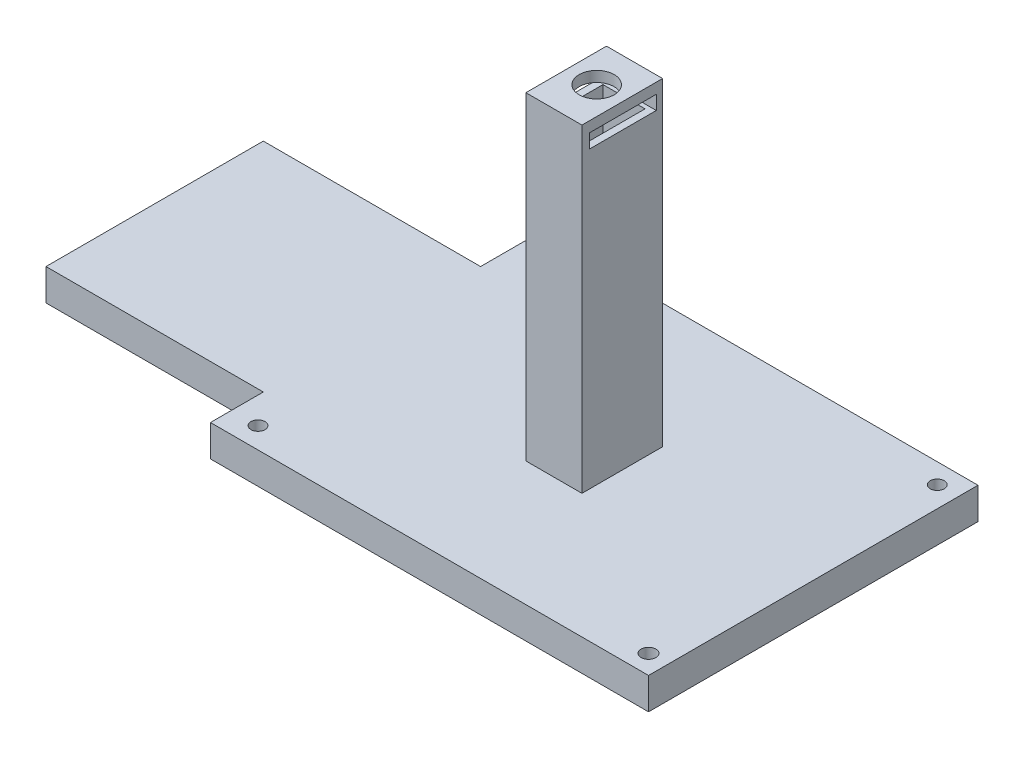
ISO-10303-21;
HEADER;
FILE_DESCRIPTION(('STEP AP214'),'2;1');
FILE_NAME('part.step','',(''),(''),'','','');
FILE_SCHEMA(('AUTOMOTIVE_DESIGN { 1 0 10303 214 1 1 1 1 }'));
ENDSEC;
DATA;
#1=APPLICATION_CONTEXT('core data for automotive mechanical design processes');
#2=APPLICATION_PROTOCOL_DEFINITION('international standard','automotive_design',2000,#1);
#3=PRODUCT_CONTEXT('',#1,'mechanical');
#4=PRODUCT('Part','Part','',(#3));
#5=PRODUCT_RELATED_PRODUCT_CATEGORY('part','',(#4));
#6=PRODUCT_DEFINITION_FORMATION('','',#4);
#7=PRODUCT_DEFINITION_CONTEXT('part definition',#1,'design');
#8=PRODUCT_DEFINITION('design','',#6,#7);
#9=PRODUCT_DEFINITION_SHAPE('','',#8);
#10=(LENGTH_UNIT() NAMED_UNIT(*) SI_UNIT(.MILLI.,.METRE.));
#11=(NAMED_UNIT(*) PLANE_ANGLE_UNIT() SI_UNIT($,.RADIAN.));
#12=(NAMED_UNIT(*) SI_UNIT($,.STERADIAN.) SOLID_ANGLE_UNIT());
#13=UNCERTAINTY_MEASURE_WITH_UNIT(LENGTH_MEASURE(1.E-05),#10,'distance_accuracy_value','');
#14=(GEOMETRIC_REPRESENTATION_CONTEXT(3) GLOBAL_UNCERTAINTY_ASSIGNED_CONTEXT((#13)) GLOBAL_UNIT_ASSIGNED_CONTEXT((#10,
#11,#12)) REPRESENTATION_CONTEXT('',''));
#15=CARTESIAN_POINT('',(0.,0.,0.));
#16=DIRECTION('',(0.,0.,1.));
#17=DIRECTION('',(1.,0.,0.));
#18=AXIS2_PLACEMENT_3D('',#15,#16,#17);
#19=CARTESIAN_POINT('',(-61.7229129662522,9.,-30.9724689165187));
#20=DIRECTION('',(1.,0.,0.));
#21=DIRECTION('',(0.,0.,-1.));
#22=AXIS2_PLACEMENT_3D('',#19,#20,#21);
#23=PLANE('',#22);
#24=DIRECTION('',(0.,-1.,0.));
#25=VECTOR('',#24,1.);
#26=CARTESIAN_POINT('',(-61.7229129662522,9.,-14.0524740715815));
#27=LINE('',#26,#25);
#28=CARTESIAN_POINT('',(-61.7229129662522,9.,-14.0524740715815));
#29=VERTEX_POINT('',#28);
#30=CARTESIAN_POINT('',(-61.7229129662522,0.,-14.0524740715815));
#31=VERTEX_POINT('',#30);
#32=EDGE_CURVE('E190',#29,#31,#27,.T.);
#33=ORIENTED_EDGE('',*,*,#32,.F.);
#34=DIRECTION('',(0.,0.,1.));
#35=VECTOR('',#34,1.);
#36=CARTESIAN_POINT('',(-61.7229129662522,9.,-30.9724689165187));
#37=LINE('',#36,#35);
#38=CARTESIAN_POINT('',(-61.7229129662522,9.,-30.9724689165187));
#39=VERTEX_POINT('',#38);
#40=EDGE_CURVE('E202',#39,#29,#37,.T.);
#41=ORIENTED_EDGE('',*,*,#40,.F.);
#42=DIRECTION('',(0.,-1.,0.));
#43=VECTOR('',#42,1.);
#44=CARTESIAN_POINT('',(-61.7229129662522,9.,-30.9724689165187));
#45=LINE('',#44,#43);
#46=CARTESIAN_POINT('',(-61.7229129662522,0.,-30.9724689165187));
#47=VERTEX_POINT('',#46);
#48=EDGE_CURVE('E224',#39,#47,#45,.T.);
#49=ORIENTED_EDGE('',*,*,#48,.T.);
#50=DIRECTION('',(0.,0.,1.));
#51=VECTOR('',#50,1.);
#52=CARTESIAN_POINT('',(-61.7229129662522,0.,-30.9724689165187));
#53=LINE('',#52,#51);
#54=EDGE_CURVE('E204',#47,#31,#53,.T.);
#55=ORIENTED_EDGE('',*,*,#54,.T.);
#56=EDGE_LOOP('',(#33,#41,#49,#55));
#57=FACE_BOUND('',#56,.T.);
#58=ADVANCED_FACE('F47',(#57),#23,.F.);
#59=CARTESIAN_POINT('',(0.,0.,0.));
#60=DIRECTION('',(0.,1.,0.));
#61=DIRECTION('',(0.,0.,1.));
#62=AXIS2_PLACEMENT_3D('',#59,#60,#61);
#63=PLANE('',#62);
#64=CARTESIAN_POINT('',(-54.169424944203,0.,57.0075310834813));
#65=DIRECTION('',(0.,1.,0.));
#66=DIRECTION('',(0.,0.,1.));
#67=AXIS2_PLACEMENT_3D('',#64,#65,#66);
#68=CIRCLE('',#67,2.00035170443916);
#69=CARTESIAN_POINT('',(-54.169424944203,0.,59.0078827879205));
#70=VERTEX_POINT('',#69);
#71=EDGE_CURVE('E205',#70,#70,#68,.T.);
#72=ORIENTED_EDGE('',*,*,#71,.T.);
#73=EDGE_LOOP('',(#72));
#74=FACE_BOUND('',#73,.T.);
#75=CARTESIAN_POINT('',(57.809152833806,0.,57.5719057944541));
#76=DIRECTION('',(0.,1.,0.));
#77=DIRECTION('',(0.,0.,1.));
#78=AXIS2_PLACEMENT_3D('',#75,#76,#77);
#79=CIRCLE('',#78,2.10858653380464);
#80=CARTESIAN_POINT('',(57.809152833806,0.,59.6804923282588));
#81=VERTEX_POINT('',#80);
#82=EDGE_CURVE('E382',#81,#81,#79,.T.);
#83=ORIENTED_EDGE('',*,*,#82,.T.);
#84=EDGE_LOOP('',(#83));
#85=FACE_BOUND('',#84,.T.);
#86=CARTESIAN_POINT('',(57.3356631587285,0.,-25.2880942055459));
#87=DIRECTION('',(0.,1.,0.));
#88=DIRECTION('',(0.,0.,1.));
#89=AXIS2_PLACEMENT_3D('',#86,#87,#88);
#90=CIRCLE('',#89,2.00297321360997);
#91=CARTESIAN_POINT('',(57.3356631587285,0.,-23.2851209919359));
#92=VERTEX_POINT('',#91);
#93=EDGE_CURVE('E379',#92,#92,#90,.T.);
#94=ORIENTED_EDGE('',*,*,#93,.T.);
#95=EDGE_LOOP('',(#94));
#96=FACE_BOUND('',#95,.T.);
#97=CARTESIAN_POINT('',(-54.5129129662522,0.,-25.8524689165187));
#98=DIRECTION('',(0.,1.,0.));
#99=DIRECTION('',(0.,0.,1.));
#100=AXIS2_PLACEMENT_3D('',#97,#98,#99);
#101=CIRCLE('',#100,2.);
#102=CARTESIAN_POINT('',(-54.5129129662522,0.,-23.8524689165187));
#103=VERTEX_POINT('',#102);
#104=EDGE_CURVE('E250',#103,#103,#101,.T.);
#105=ORIENTED_EDGE('',*,*,#104,.T.);
#106=EDGE_LOOP('',(#105));
#107=FACE_BOUND('',#106,.T.);
#108=ORIENTED_EDGE('',*,*,#54,.F.);
#109=DIRECTION('',(-1.,0.,0.));
#110=VECTOR('',#109,1.);
#111=CARTESIAN_POINT('',(-61.7229129662522,0.,-30.9724689165187));
#112=LINE('',#111,#110);
#113=CARTESIAN_POINT('',(63.2770870337478,0.,-30.9724689165187));
#114=VERTEX_POINT('',#113);
#115=EDGE_CURVE('E217',#114,#47,#112,.T.);
#116=ORIENTED_EDGE('',*,*,#115,.F.);
#117=DIRECTION('',(0.,0.,-1.));
#118=VECTOR('',#117,1.);
#119=CARTESIAN_POINT('',(63.2770870337478,0.,-30.9724689165187));
#120=LINE('',#119,#118);
#121=CARTESIAN_POINT('',(63.2770870337478,0.,63.0275310834813));
#122=VERTEX_POINT('',#121);
#123=EDGE_CURVE('E229',#122,#114,#120,.T.);
#124=ORIENTED_EDGE('',*,*,#123,.F.);
#125=DIRECTION('',(1.,0.,0.));
#126=VECTOR('',#125,1.);
#127=CARTESIAN_POINT('',(-61.7229129662522,0.,63.0275310834813));
#128=LINE('',#127,#126);
#129=CARTESIAN_POINT('',(-61.7229129662522,0.,63.0275310834813));
#130=VERTEX_POINT('',#129);
#131=EDGE_CURVE('E226',#130,#122,#128,.T.);
#132=ORIENTED_EDGE('',*,*,#131,.F.);
#133=CARTESIAN_POINT('',(-61.7229129662522,0.,47.9475259284185));
#134=VERTEX_POINT('',#133);
#135=EDGE_CURVE('E227',#134,#130,#53,.T.);
#136=ORIENTED_EDGE('',*,*,#135,.F.);
#137=DIRECTION('',(1.,0.,0.));
#138=VECTOR('',#137,1.);
#139=CARTESIAN_POINT('',(-61.7229129662522,0.,47.9475259284185));
#140=LINE('',#139,#138);
#141=CARTESIAN_POINT('',(-123.722912966252,0.,47.9475259284185));
#142=VERTEX_POINT('',#141);
#143=EDGE_CURVE('E64',#142,#134,#140,.T.);
#144=ORIENTED_EDGE('',*,*,#143,.F.);
#145=DIRECTION('',(0.,0.,1.));
#146=VECTOR('',#145,1.);
#147=CARTESIAN_POINT('',(-123.722912966252,0.,47.9475259284185));
#148=LINE('',#147,#146);
#149=CARTESIAN_POINT('',(-123.722912966252,0.,-14.0524740715815));
#150=VERTEX_POINT('',#149);
#151=EDGE_CURVE('E434',#150,#142,#148,.T.);
#152=ORIENTED_EDGE('',*,*,#151,.F.);
#153=DIRECTION('',(-1.,0.,0.));
#154=VECTOR('',#153,1.);
#155=CARTESIAN_POINT('',(-61.7229129662522,0.,-14.0524740715815));
#156=LINE('',#155,#154);
#157=EDGE_CURVE('E433',#31,#150,#156,.T.);
#158=ORIENTED_EDGE('',*,*,#157,.F.);
#159=EDGE_LOOP('',(#108,#116,#124,#132,#136,#144,#152,#158));
#160=FACE_BOUND('',#159,.T.);
#161=DIRECTION('',(0.,0.,1.));
#162=VECTOR('',#161,1.);
#163=CARTESIAN_POINT('',(-5.22291296625223,0.,7.52753108348134));
#164=LINE('',#163,#162);
#165=CARTESIAN_POINT('',(-5.22291296625223,0.,7.52753108348134));
#166=VERTEX_POINT('',#165);
#167=CARTESIAN_POINT('',(-5.22291296625223,0.,24.5275310834813));
#168=VERTEX_POINT('',#167);
#169=EDGE_CURVE('E302',#166,#168,#164,.T.);
#170=ORIENTED_EDGE('',*,*,#169,.T.);
#171=DIRECTION('',(1.,0.,0.));
#172=VECTOR('',#171,1.);
#173=CARTESIAN_POINT('',(-5.22291296625223,0.,24.5275310834813));
#174=LINE('',#173,#172);
#175=CARTESIAN_POINT('',(6.77708703374778,0.,24.5275310834813));
#176=VERTEX_POINT('',#175);
#177=EDGE_CURVE('E305',#168,#176,#174,.T.);
#178=ORIENTED_EDGE('',*,*,#177,.T.);
#179=DIRECTION('',(0.,0.,-1.));
#180=VECTOR('',#179,1.);
#181=CARTESIAN_POINT('',(6.77708703374777,0.,7.52753108348134));
#182=LINE('',#181,#180);
#183=CARTESIAN_POINT('',(6.77708703374777,0.,7.52753108348134));
#184=VERTEX_POINT('',#183);
#185=EDGE_CURVE('E308',#176,#184,#182,.T.);
#186=ORIENTED_EDGE('',*,*,#185,.T.);
#187=DIRECTION('',(-1.,0.,0.));
#188=VECTOR('',#187,1.);
#189=CARTESIAN_POINT('',(-5.22291296625223,0.,7.52753108348134));
#190=LINE('',#189,#188);
#191=EDGE_CURVE('E311',#184,#166,#190,.T.);
#192=ORIENTED_EDGE('',*,*,#191,.T.);
#193=EDGE_LOOP('',(#170,#178,#186,#192));
#194=FACE_BOUND('',#193,.T.);
#195=ADVANCED_FACE('F358',(#74,#85,#96,#107,#160,#194),#63,.F.);
#196=CARTESIAN_POINT('',(0.,9.,0.));
#197=DIRECTION('',(0.,1.,0.));
#198=DIRECTION('',(0.,0.,1.));
#199=AXIS2_PLACEMENT_3D('',#196,#197,#198);
#200=PLANE('',#199);
#201=CARTESIAN_POINT('',(-54.169424944203,8.99999999999999,57.0075310834813));
#202=DIRECTION('',(0.,1.,0.));
#203=DIRECTION('',(0.,0.,1.));
#204=AXIS2_PLACEMENT_3D('',#201,#202,#203);
#205=CIRCLE('',#204,2.00035170443916);
#206=CARTESIAN_POINT('',(-54.169424944203,8.99999999999999,59.0078827879205));
#207=VERTEX_POINT('',#206);
#208=EDGE_CURVE('E51',#207,#207,#205,.F.);
#209=ORIENTED_EDGE('',*,*,#208,.T.);
#210=EDGE_LOOP('',(#209));
#211=FACE_BOUND('',#210,.T.);
#212=CARTESIAN_POINT('',(57.809152833806,8.99999999999999,57.5719057944541));
#213=DIRECTION('',(0.,1.,0.));
#214=DIRECTION('',(0.,0.,1.));
#215=AXIS2_PLACEMENT_3D('',#212,#213,#214);
#216=CIRCLE('',#215,2.10858653380464);
#217=CARTESIAN_POINT('',(57.809152833806,8.99999999999999,59.6804923282588));
#218=VERTEX_POINT('',#217);
#219=EDGE_CURVE('E252',#218,#218,#216,.F.);
#220=ORIENTED_EDGE('',*,*,#219,.T.);
#221=EDGE_LOOP('',(#220));
#222=FACE_BOUND('',#221,.T.);
#223=CARTESIAN_POINT('',(57.3356631587285,8.99999999999999,-25.2880942055459));
#224=DIRECTION('',(0.,1.,0.));
#225=DIRECTION('',(0.,0.,1.));
#226=AXIS2_PLACEMENT_3D('',#223,#224,#225);
#227=CIRCLE('',#226,2.00297321360997);
#228=CARTESIAN_POINT('',(57.3356631587285,8.99999999999999,-23.2851209919359));
#229=VERTEX_POINT('',#228);
#230=EDGE_CURVE('E249',#229,#229,#227,.F.);
#231=ORIENTED_EDGE('',*,*,#230,.T.);
#232=EDGE_LOOP('',(#231));
#233=FACE_BOUND('',#232,.T.);
#234=CARTESIAN_POINT('',(-54.5129129662522,8.99999999999999,-25.8524689165187));
#235=DIRECTION('',(0.,1.,0.));
#236=DIRECTION('',(0.,0.,1.));
#237=AXIS2_PLACEMENT_3D('',#234,#235,#236);
#238=CIRCLE('',#237,2.);
#239=CARTESIAN_POINT('',(-54.5129129662522,8.99999999999999,-23.8524689165187));
#240=VERTEX_POINT('',#239);
#241=EDGE_CURVE('E246',#240,#240,#238,.F.);
#242=ORIENTED_EDGE('',*,*,#241,.T.);
#243=EDGE_LOOP('',(#242));
#244=FACE_BOUND('',#243,.T.);
#245=ORIENTED_EDGE('',*,*,#40,.T.);
#246=DIRECTION('',(-1.,0.,0.));
#247=VECTOR('',#246,1.);
#248=CARTESIAN_POINT('',(-61.7229129662522,9.,-14.0524740715815));
#249=LINE('',#248,#247);
#250=CARTESIAN_POINT('',(-123.722912966252,9.,-14.0524740715815));
#251=VERTEX_POINT('',#250);
#252=EDGE_CURVE('E187',#29,#251,#249,.T.);
#253=ORIENTED_EDGE('',*,*,#252,.T.);
#254=DIRECTION('',(0.,0.,1.));
#255=VECTOR('',#254,1.);
#256=CARTESIAN_POINT('',(-123.722912966252,9.,47.9475259284185));
#257=LINE('',#256,#255);
#258=CARTESIAN_POINT('',(-123.722912966252,9.,47.9475259284185));
#259=VERTEX_POINT('',#258);
#260=EDGE_CURVE('E197',#251,#259,#257,.T.);
#261=ORIENTED_EDGE('',*,*,#260,.T.);
#262=DIRECTION('',(1.,0.,0.));
#263=VECTOR('',#262,1.);
#264=CARTESIAN_POINT('',(-61.7229129662522,9.,47.9475259284185));
#265=LINE('',#264,#263);
#266=CARTESIAN_POINT('',(-61.7229129662522,9.,47.9475259284185));
#267=VERTEX_POINT('',#266);
#268=EDGE_CURVE('E368',#259,#267,#265,.T.);
#269=ORIENTED_EDGE('',*,*,#268,.T.);
#270=CARTESIAN_POINT('',(-61.7229129662522,9.,63.0275310834813));
#271=VERTEX_POINT('',#270);
#272=EDGE_CURVE('E213',#267,#271,#37,.T.);
#273=ORIENTED_EDGE('',*,*,#272,.T.);
#274=DIRECTION('',(1.,0.,0.));
#275=VECTOR('',#274,1.);
#276=CARTESIAN_POINT('',(-61.7229129662522,9.,63.0275310834813));
#277=LINE('',#276,#275);
#278=CARTESIAN_POINT('',(63.2770870337478,9.,63.0275310834813));
#279=VERTEX_POINT('',#278);
#280=EDGE_CURVE('E212',#271,#279,#277,.T.);
#281=ORIENTED_EDGE('',*,*,#280,.T.);
#282=DIRECTION('',(0.,0.,-1.));
#283=VECTOR('',#282,1.);
#284=CARTESIAN_POINT('',(63.2770870337478,9.,-30.9724689165187));
#285=LINE('',#284,#283);
#286=CARTESIAN_POINT('',(63.2770870337478,9.,-30.9724689165187));
#287=VERTEX_POINT('',#286);
#288=EDGE_CURVE('E215',#279,#287,#285,.T.);
#289=ORIENTED_EDGE('',*,*,#288,.T.);
#290=DIRECTION('',(-1.,0.,0.));
#291=VECTOR('',#290,1.);
#292=CARTESIAN_POINT('',(-61.7229129662522,9.,-30.9724689165187));
#293=LINE('',#292,#291);
#294=EDGE_CURVE('E210',#287,#39,#293,.T.);
#295=ORIENTED_EDGE('',*,*,#294,.T.);
#296=EDGE_LOOP('',(#245,#253,#261,#269,#273,#281,#289,#295));
#297=FACE_BOUND('',#296,.T.);
#298=DIRECTION('',(-1.,0.,0.));
#299=VECTOR('',#298,1.);
#300=CARTESIAN_POINT('',(0.,9.,27.5275310834813));
#301=LINE('',#300,#299);
#302=CARTESIAN_POINT('',(8.77708703374777,8.99999999999999,27.5275310834813));
#303=VERTEX_POINT('',#302);
#304=CARTESIAN_POINT('',(-7.22291296625223,8.99999999999999,27.5275310834813));
#305=VERTEX_POINT('',#304);
#306=EDGE_CURVE('E347',#303,#305,#301,.T.);
#307=ORIENTED_EDGE('',*,*,#306,.T.);
#308=DIRECTION('',(0.,0.,-1.));
#309=VECTOR('',#308,1.);
#310=CARTESIAN_POINT('',(-7.22291296625223,9.,0.));
#311=LINE('',#310,#309);
#312=CARTESIAN_POINT('',(-7.22291296625223,8.99999999999999,4.52753108348134));
#313=VERTEX_POINT('',#312);
#314=EDGE_CURVE('E219',#305,#313,#311,.T.);
#315=ORIENTED_EDGE('',*,*,#314,.T.);
#316=DIRECTION('',(1.,0.,0.));
#317=VECTOR('',#316,1.);
#318=CARTESIAN_POINT('',(0.,9.,4.52753108348134));
#319=LINE('',#318,#317);
#320=CARTESIAN_POINT('',(8.77708703374777,9.,4.52753108348134));
#321=VERTEX_POINT('',#320);
#322=EDGE_CURVE('E342',#313,#321,#319,.T.);
#323=ORIENTED_EDGE('',*,*,#322,.T.);
#324=DIRECTION('',(0.,0.,1.));
#325=VECTOR('',#324,1.);
#326=CARTESIAN_POINT('',(8.77708703374777,9.,0.));
#327=LINE('',#326,#325);
#328=EDGE_CURVE('E345',#321,#303,#327,.T.);
#329=ORIENTED_EDGE('',*,*,#328,.T.);
#330=EDGE_LOOP('',(#307,#315,#323,#329));
#331=FACE_BOUND('',#330,.T.);
#332=ADVANCED_FACE('F207',(#211,#222,#233,#244,#297,#331),#200,.T.);
#333=ORIENTED_EDGE('',*,*,#272,.F.);
#334=DIRECTION('',(0.,-1.,0.));
#335=VECTOR('',#334,1.);
#336=CARTESIAN_POINT('',(-61.7229129662522,9.,47.9475259284185));
#337=LINE('',#336,#335);
#338=EDGE_CURVE('E355',#267,#134,#337,.T.);
#339=ORIENTED_EDGE('',*,*,#338,.T.);
#340=ORIENTED_EDGE('',*,*,#135,.T.);
#341=DIRECTION('',(0.,-1.,0.));
#342=VECTOR('',#341,1.);
#343=CARTESIAN_POINT('',(-61.7229129662522,9.,63.0275310834813));
#344=LINE('',#343,#342);
#345=EDGE_CURVE('E56',#271,#130,#344,.T.);
#346=ORIENTED_EDGE('',*,*,#345,.F.);
#347=EDGE_LOOP('',(#333,#339,#340,#346));
#348=FACE_BOUND('',#347,.T.);
#349=ADVANCED_FACE('F49',(#348),#23,.F.);
#350=CARTESIAN_POINT('',(-61.7229129662522,9.,63.0275310834813));
#351=DIRECTION('',(0.,0.,-1.));
#352=DIRECTION('',(-1.,0.,0.));
#353=AXIS2_PLACEMENT_3D('',#350,#351,#352);
#354=PLANE('',#353);
#355=ORIENTED_EDGE('',*,*,#131,.T.);
#356=DIRECTION('',(0.,-1.,0.));
#357=VECTOR('',#356,1.);
#358=CARTESIAN_POINT('',(63.2770870337478,9.,63.0275310834813));
#359=LINE('',#358,#357);
#360=EDGE_CURVE('E236',#279,#122,#359,.T.);
#361=ORIENTED_EDGE('',*,*,#360,.F.);
#362=ORIENTED_EDGE('',*,*,#280,.F.);
#363=ORIENTED_EDGE('',*,*,#345,.T.);
#364=EDGE_LOOP('',(#355,#361,#362,#363));
#365=FACE_BOUND('',#364,.T.);
#366=ADVANCED_FACE('F364',(#365),#354,.F.);
#367=CARTESIAN_POINT('',(63.2770870337478,9.,-30.9724689165187));
#368=DIRECTION('',(-1.,0.,0.));
#369=DIRECTION('',(0.,0.,1.));
#370=AXIS2_PLACEMENT_3D('',#367,#368,#369);
#371=PLANE('',#370);
#372=ORIENTED_EDGE('',*,*,#123,.T.);
#373=DIRECTION('',(0.,-1.,0.));
#374=VECTOR('',#373,1.);
#375=CARTESIAN_POINT('',(63.2770870337478,9.,-30.9724689165187));
#376=LINE('',#375,#374);
#377=EDGE_CURVE('E233',#287,#114,#376,.T.);
#378=ORIENTED_EDGE('',*,*,#377,.F.);
#379=ORIENTED_EDGE('',*,*,#288,.F.);
#380=ORIENTED_EDGE('',*,*,#360,.T.);
#381=EDGE_LOOP('',(#372,#378,#379,#380));
#382=FACE_BOUND('',#381,.T.);
#383=ADVANCED_FACE('F416',(#382),#371,.F.);
#384=CARTESIAN_POINT('',(-61.7229129662522,9.,-30.9724689165187));
#385=DIRECTION('',(0.,0.,1.));
#386=DIRECTION('',(1.,0.,0.));
#387=AXIS2_PLACEMENT_3D('',#384,#385,#386);
#388=PLANE('',#387);
#389=ORIENTED_EDGE('',*,*,#115,.T.);
#390=ORIENTED_EDGE('',*,*,#48,.F.);
#391=ORIENTED_EDGE('',*,*,#294,.F.);
#392=ORIENTED_EDGE('',*,*,#377,.T.);
#393=EDGE_LOOP('',(#389,#390,#391,#392));
#394=FACE_BOUND('',#393,.T.);
#395=ADVANCED_FACE('F424',(#394),#388,.F.);
#396=CARTESIAN_POINT('',(-7.22291296625223,100.,4.52753108348134));
#397=DIRECTION('',(1.,0.,0.));
#398=DIRECTION('',(0.,0.,-1.));
#399=AXIS2_PLACEMENT_3D('',#396,#397,#398);
#400=PLANE('',#399);
#401=DIRECTION('',(0.,1.,0.));
#402=VECTOR('',#401,1.);
#403=CARTESIAN_POINT('',(-7.22291296625223,100.,6.32354672402767));
#404=LINE('',#403,#402);
#405=CARTESIAN_POINT('',(-7.22291296625223,93.,6.32354672402767));
#406=VERTEX_POINT('',#405);
#407=CARTESIAN_POINT('',(-7.22291296625223,97.,6.32354672402767));
#408=VERTEX_POINT('',#407);
#409=EDGE_CURVE('E296',#406,#408,#404,.T.);
#410=ORIENTED_EDGE('',*,*,#409,.T.);
#411=DIRECTION('',(0.,0.,1.));
#412=VECTOR('',#411,1.);
#413=CARTESIAN_POINT('',(-7.22291296625223,97.,4.52753108348134));
#414=LINE('',#413,#412);
#415=CARTESIAN_POINT('',(-7.22291296625223,97.,25.3235467240277));
#416=VERTEX_POINT('',#415);
#417=EDGE_CURVE('E243',#408,#416,#414,.T.);
#418=ORIENTED_EDGE('',*,*,#417,.T.);
#419=DIRECTION('',(0.,-1.,0.));
#420=VECTOR('',#419,1.);
#421=CARTESIAN_POINT('',(-7.22291296625223,100.,25.3235467240277));
#422=LINE('',#421,#420);
#423=CARTESIAN_POINT('',(-7.22291296625223,93.,25.3235467240277));
#424=VERTEX_POINT('',#423);
#425=EDGE_CURVE('E293',#416,#424,#422,.T.);
#426=ORIENTED_EDGE('',*,*,#425,.T.);
#427=DIRECTION('',(0.,0.,-1.));
#428=VECTOR('',#427,1.);
#429=CARTESIAN_POINT('',(-7.22291296625223,93.,4.52753108348134));
#430=LINE('',#429,#428);
#431=EDGE_CURVE('E290',#424,#406,#430,.T.);
#432=ORIENTED_EDGE('',*,*,#431,.T.);
#433=EDGE_LOOP('',(#410,#418,#426,#432));
#434=FACE_BOUND('',#433,.T.);
#435=ORIENTED_EDGE('',*,*,#314,.F.);
#436=DIRECTION('',(0.,-1.,0.));
#437=VECTOR('',#436,1.);
#438=CARTESIAN_POINT('',(-7.22291296625223,100.,27.5275310834813));
#439=LINE('',#438,#437);
#440=CARTESIAN_POINT('',(-7.22291296625223,100.,27.5275310834813));
#441=VERTEX_POINT('',#440);
#442=EDGE_CURVE('E339',#441,#305,#439,.T.);
#443=ORIENTED_EDGE('',*,*,#442,.F.);
#444=DIRECTION('',(0.,0.,1.));
#445=VECTOR('',#444,1.);
#446=CARTESIAN_POINT('',(-7.22291296625223,100.,4.52753108348134));
#447=LINE('',#446,#445);
#448=CARTESIAN_POINT('',(-7.22291296625223,100.,4.52753108348134));
#449=VERTEX_POINT('',#448);
#450=EDGE_CURVE('E322',#449,#441,#447,.T.);
#451=ORIENTED_EDGE('',*,*,#450,.F.);
#452=DIRECTION('',(0.,-1.,0.));
#453=VECTOR('',#452,1.);
#454=CARTESIAN_POINT('',(-7.22291296625223,100.,4.52753108348134));
#455=LINE('',#454,#453);
#456=EDGE_CURVE('E331',#449,#313,#455,.T.);
#457=ORIENTED_EDGE('',*,*,#456,.T.);
#458=EDGE_LOOP('',(#435,#443,#451,#457));
#459=FACE_BOUND('',#458,.T.);
#460=ADVANCED_FACE('F421',(#434,#459),#400,.F.);
#461=CARTESIAN_POINT('',(-7.22291296625223,100.,27.5275310834813));
#462=DIRECTION('',(0.,0.,-1.));
#463=DIRECTION('',(-1.,0.,0.));
#464=AXIS2_PLACEMENT_3D('',#461,#462,#463);
#465=PLANE('',#464);
#466=ORIENTED_EDGE('',*,*,#306,.F.);
#467=DIRECTION('',(0.,-1.,0.));
#468=VECTOR('',#467,1.);
#469=CARTESIAN_POINT('',(8.77708703374777,100.,27.5275310834813));
#470=LINE('',#469,#468);
#471=CARTESIAN_POINT('',(8.77708703374777,100.,27.5275310834813));
#472=VERTEX_POINT('',#471);
#473=EDGE_CURVE('E336',#472,#303,#470,.T.);
#474=ORIENTED_EDGE('',*,*,#473,.F.);
#475=DIRECTION('',(1.,0.,0.));
#476=VECTOR('',#475,1.);
#477=CARTESIAN_POINT('',(-7.22291296625223,100.,27.5275310834813));
#478=LINE('',#477,#476);
#479=EDGE_CURVE('E325',#441,#472,#478,.T.);
#480=ORIENTED_EDGE('',*,*,#479,.F.);
#481=ORIENTED_EDGE('',*,*,#442,.T.);
#482=EDGE_LOOP('',(#466,#474,#480,#481));
#483=FACE_BOUND('',#482,.T.);
#484=ADVANCED_FACE('F511',(#483),#465,.F.);
#485=CARTESIAN_POINT('',(8.77708703374777,100.,4.52753108348134));
#486=DIRECTION('',(-1.,0.,0.));
#487=DIRECTION('',(0.,0.,1.));
#488=AXIS2_PLACEMENT_3D('',#485,#486,#487);
#489=PLANE('',#488);
#490=DIRECTION('',(0.,-1.,0.));
#491=VECTOR('',#490,1.);
#492=CARTESIAN_POINT('',(8.77708703374777,100.,25.3235467240277));
#493=LINE('',#492,#491);
#494=CARTESIAN_POINT('',(8.77708703374777,97.,25.3235467240277));
#495=VERTEX_POINT('',#494);
#496=CARTESIAN_POINT('',(8.77708703374777,93.,25.3235467240277));
#497=VERTEX_POINT('',#496);
#498=EDGE_CURVE('E260',#495,#497,#493,.T.);
#499=ORIENTED_EDGE('',*,*,#498,.F.);
#500=DIRECTION('',(0.,0.,1.));
#501=VECTOR('',#500,1.);
#502=CARTESIAN_POINT('',(8.77708703374777,97.,4.52753108348134));
#503=LINE('',#502,#501);
#504=CARTESIAN_POINT('',(8.77708703374777,97.,6.32354672402767));
#505=VERTEX_POINT('',#504);
#506=EDGE_CURVE('E257',#505,#495,#503,.T.);
#507=ORIENTED_EDGE('',*,*,#506,.F.);
#508=DIRECTION('',(0.,1.,0.));
#509=VECTOR('',#508,1.);
#510=CARTESIAN_POINT('',(8.77708703374777,100.,6.32354672402767));
#511=LINE('',#510,#509);
#512=CARTESIAN_POINT('',(8.77708703374777,93.,6.32354672402767));
#513=VERTEX_POINT('',#512);
#514=EDGE_CURVE('E273',#513,#505,#511,.T.);
#515=ORIENTED_EDGE('',*,*,#514,.F.);
#516=DIRECTION('',(0.,0.,-1.));
#517=VECTOR('',#516,1.);
#518=CARTESIAN_POINT('',(8.77708703374777,93.,4.52753108348134));
#519=LINE('',#518,#517);
#520=EDGE_CURVE('E266',#497,#513,#519,.T.);
#521=ORIENTED_EDGE('',*,*,#520,.F.);
#522=EDGE_LOOP('',(#499,#507,#515,#521));
#523=FACE_BOUND('',#522,.T.);
#524=ORIENTED_EDGE('',*,*,#328,.F.);
#525=DIRECTION('',(0.,-1.,0.));
#526=VECTOR('',#525,1.);
#527=CARTESIAN_POINT('',(8.77708703374777,100.,4.52753108348134));
#528=LINE('',#527,#526);
#529=CARTESIAN_POINT('',(8.77708703374777,100.,4.52753108348134));
#530=VERTEX_POINT('',#529);
#531=EDGE_CURVE('E334',#530,#321,#528,.T.);
#532=ORIENTED_EDGE('',*,*,#531,.F.);
#533=DIRECTION('',(0.,0.,-1.));
#534=VECTOR('',#533,1.);
#535=CARTESIAN_POINT('',(8.77708703374777,100.,4.52753108348134));
#536=LINE('',#535,#534);
#537=EDGE_CURVE('E327',#472,#530,#536,.T.);
#538=ORIENTED_EDGE('',*,*,#537,.F.);
#539=ORIENTED_EDGE('',*,*,#473,.T.);
#540=EDGE_LOOP('',(#524,#532,#538,#539));
#541=FACE_BOUND('',#540,.T.);
#542=ADVANCED_FACE('F508',(#523,#541),#489,.F.);
#543=CARTESIAN_POINT('',(-7.22291296625223,100.,4.52753108348134));
#544=DIRECTION('',(0.,0.,1.));
#545=DIRECTION('',(1.,0.,0.));
#546=AXIS2_PLACEMENT_3D('',#543,#544,#545);
#547=PLANE('',#546);
#548=ORIENTED_EDGE('',*,*,#322,.F.);
#549=ORIENTED_EDGE('',*,*,#456,.F.);
#550=DIRECTION('',(-1.,0.,0.));
#551=VECTOR('',#550,1.);
#552=CARTESIAN_POINT('',(-7.22291296625223,100.,4.52753108348134));
#553=LINE('',#552,#551);
#554=EDGE_CURVE('E329',#530,#449,#553,.T.);
#555=ORIENTED_EDGE('',*,*,#554,.F.);
#556=ORIENTED_EDGE('',*,*,#531,.T.);
#557=EDGE_LOOP('',(#548,#549,#555,#556));
#558=FACE_BOUND('',#557,.T.);
#559=ADVANCED_FACE('F504',(#558),#547,.F.);
#560=CARTESIAN_POINT('',(0.,100.,0.));
#561=DIRECTION('',(0.,1.,0.));
#562=DIRECTION('',(0.,0.,1.));
#563=AXIS2_PLACEMENT_3D('',#560,#561,#562);
#564=PLANE('',#563);
#565=CARTESIAN_POINT('',(0.905359976839715,100.,15.4503028395672));
#566=DIRECTION('',(0.,1.,0.));
#567=DIRECTION('',(0.,0.,1.));
#568=AXIS2_PLACEMENT_3D('',#565,#566,#567);
#569=CIRCLE('',#568,5.);
#570=CARTESIAN_POINT('',(0.905359976839715,100.,20.4503028395672));
#571=VERTEX_POINT('',#570);
#572=EDGE_CURVE('E299',#571,#571,#569,.T.);
#573=ORIENTED_EDGE('',*,*,#572,.F.);
#574=EDGE_LOOP('',(#573));
#575=FACE_BOUND('',#574,.T.);
#576=ORIENTED_EDGE('',*,*,#450,.T.);
#577=ORIENTED_EDGE('',*,*,#479,.T.);
#578=ORIENTED_EDGE('',*,*,#537,.T.);
#579=ORIENTED_EDGE('',*,*,#554,.T.);
#580=EDGE_LOOP('',(#576,#577,#578,#579));
#581=FACE_BOUND('',#580,.T.);
#582=ADVANCED_FACE('F500',(#575,#581),#564,.T.);
#583=CARTESIAN_POINT('',(-5.22291296625223,96.5,7.52753108348134));
#584=DIRECTION('',(1.,0.,0.));
#585=DIRECTION('',(0.,0.,-1.));
#586=AXIS2_PLACEMENT_3D('',#583,#584,#585);
#587=PLANE('',#586);
#588=DIRECTION('',(0.,0.,-1.));
#589=VECTOR('',#588,1.);
#590=CARTESIAN_POINT('',(-5.22291296625223,93.,7.52753108348134));
#591=LINE('',#590,#589);
#592=CARTESIAN_POINT('',(-5.22291296625223,93.,24.5275310834813));
#593=VERTEX_POINT('',#592);
#594=CARTESIAN_POINT('',(-5.22291296625223,93.,7.52753108348134));
#595=VERTEX_POINT('',#594);
#596=EDGE_CURVE('E288',#593,#595,#591,.T.);
#597=ORIENTED_EDGE('',*,*,#596,.F.);
#598=DIRECTION('',(0.,-1.,0.));
#599=VECTOR('',#598,1.);
#600=CARTESIAN_POINT('',(-5.22291296625223,96.5,24.5275310834813));
#601=LINE('',#600,#599);
#602=EDGE_CURVE('E320',#593,#168,#601,.T.);
#603=ORIENTED_EDGE('',*,*,#602,.T.);
#604=ORIENTED_EDGE('',*,*,#169,.F.);
#605=DIRECTION('',(0.,-1.,0.));
#606=VECTOR('',#605,1.);
#607=CARTESIAN_POINT('',(-5.22291296625223,96.5,7.52753108348134));
#608=LINE('',#607,#606);
#609=EDGE_CURVE('E314',#595,#166,#608,.T.);
#610=ORIENTED_EDGE('',*,*,#609,.F.);
#611=EDGE_LOOP('',(#597,#603,#604,#610));
#612=FACE_BOUND('',#611,.T.);
#613=ADVANCED_FACE('F496',(#612),#587,.T.);
#614=CARTESIAN_POINT('',(-5.22291296625223,96.5,24.5275310834813));
#615=DIRECTION('',(0.,0.,-1.));
#616=DIRECTION('',(-1.,0.,0.));
#617=AXIS2_PLACEMENT_3D('',#614,#615,#616);
#618=PLANE('',#617);
#619=DIRECTION('',(-1.,0.,0.));
#620=VECTOR('',#619,1.);
#621=CARTESIAN_POINT('',(-5.22291296625223,93.,24.5275310834813));
#622=LINE('',#621,#620);
#623=CARTESIAN_POINT('',(6.77708703374778,93.,24.5275310834813));
#624=VERTEX_POINT('',#623);
#625=EDGE_CURVE('E286',#624,#593,#622,.T.);
#626=ORIENTED_EDGE('',*,*,#625,.F.);
#627=DIRECTION('',(0.,-1.,0.));
#628=VECTOR('',#627,1.);
#629=CARTESIAN_POINT('',(6.77708703374778,96.5,24.5275310834813));
#630=LINE('',#629,#628);
#631=EDGE_CURVE('E318',#624,#176,#630,.T.);
#632=ORIENTED_EDGE('',*,*,#631,.T.);
#633=ORIENTED_EDGE('',*,*,#177,.F.);
#634=ORIENTED_EDGE('',*,*,#602,.F.);
#635=EDGE_LOOP('',(#626,#632,#633,#634));
#636=FACE_BOUND('',#635,.T.);
#637=ADVANCED_FACE('F492',(#636),#618,.T.);
#638=CARTESIAN_POINT('',(6.77708703374777,96.5,7.52753108348134));
#639=DIRECTION('',(-1.,0.,0.));
#640=DIRECTION('',(0.,0.,1.));
#641=AXIS2_PLACEMENT_3D('',#638,#639,#640);
#642=PLANE('',#641);
#643=DIRECTION('',(0.,0.,1.));
#644=VECTOR('',#643,1.);
#645=CARTESIAN_POINT('',(6.77708703374777,93.,7.52753108348134));
#646=LINE('',#645,#644);
#647=CARTESIAN_POINT('',(6.77708703374777,93.,7.52753108348134));
#648=VERTEX_POINT('',#647);
#649=EDGE_CURVE('E284',#648,#624,#646,.T.);
#650=ORIENTED_EDGE('',*,*,#649,.F.);
#651=DIRECTION('',(0.,-1.,0.));
#652=VECTOR('',#651,1.);
#653=CARTESIAN_POINT('',(6.77708703374777,96.5,7.52753108348134));
#654=LINE('',#653,#652);
#655=EDGE_CURVE('E316',#648,#184,#654,.T.);
#656=ORIENTED_EDGE('',*,*,#655,.T.);
#657=ORIENTED_EDGE('',*,*,#185,.F.);
#658=ORIENTED_EDGE('',*,*,#631,.F.);
#659=EDGE_LOOP('',(#650,#656,#657,#658));
#660=FACE_BOUND('',#659,.T.);
#661=ADVANCED_FACE('F488',(#660),#642,.T.);
#662=CARTESIAN_POINT('',(-5.22291296625223,96.5,7.52753108348134));
#663=DIRECTION('',(0.,0.,1.));
#664=DIRECTION('',(1.,0.,0.));
#665=AXIS2_PLACEMENT_3D('',#662,#663,#664);
#666=PLANE('',#665);
#667=DIRECTION('',(1.,0.,0.));
#668=VECTOR('',#667,1.);
#669=CARTESIAN_POINT('',(-5.22291296625223,93.,7.52753108348134));
#670=LINE('',#669,#668);
#671=EDGE_CURVE('E13',#595,#648,#670,.T.);
#672=ORIENTED_EDGE('',*,*,#671,.F.);
#673=ORIENTED_EDGE('',*,*,#609,.T.);
#674=ORIENTED_EDGE('',*,*,#191,.F.);
#675=ORIENTED_EDGE('',*,*,#655,.F.);
#676=EDGE_LOOP('',(#672,#673,#674,#675));
#677=FACE_BOUND('',#676,.T.);
#678=ADVANCED_FACE('F484',(#677),#666,.T.);
#679=CARTESIAN_POINT('',(0.905359976839715,0.,15.4503028395672));
#680=DIRECTION('',(0.,1.,0.));
#681=DIRECTION('',(0.,0.,1.));
#682=AXIS2_PLACEMENT_3D('',#679,#680,#681);
#683=CYLINDRICAL_SURFACE('',#682,5.);
#684=CARTESIAN_POINT('',(0.905359976839715,97.,15.4503028395672));
#685=DIRECTION('',(0.,1.,0.));
#686=DIRECTION('',(0.,0.,1.));
#687=AXIS2_PLACEMENT_3D('',#684,#685,#686);
#688=CIRCLE('',#687,5.);
#689=CARTESIAN_POINT('',(0.905359976839715,97.,20.4503028395672));
#690=VERTEX_POINT('',#689);
#691=EDGE_CURVE('E241',#690,#690,#688,.F.);
#692=ORIENTED_EDGE('',*,*,#691,.T.);
#693=EDGE_LOOP('',(#692));
#694=FACE_BOUND('',#693,.T.);
#695=ORIENTED_EDGE('',*,*,#572,.T.);
#696=EDGE_LOOP('',(#695));
#697=FACE_BOUND('',#696,.T.);
#698=ADVANCED_FACE('F475',(#694,#697),#683,.F.);
#699=CARTESIAN_POINT('',(-91.2229129662522,100.,6.32354672402767));
#700=DIRECTION('',(0.,0.,-1.));
#701=DIRECTION('',(0.,1.,0.));
#702=AXIS2_PLACEMENT_3D('',#699,#700,#701);
#703=PLANE('',#702);
#704=DIRECTION('',(1.,0.,0.));
#705=VECTOR('',#704,1.);
#706=CARTESIAN_POINT('',(-91.2229129662522,93.,6.32354672402767));
#707=LINE('',#706,#705);
#708=EDGE_CURVE('E278',#406,#513,#707,.T.);
#709=ORIENTED_EDGE('',*,*,#708,.T.);
#710=ORIENTED_EDGE('',*,*,#514,.T.);
#711=DIRECTION('',(1.,0.,0.));
#712=VECTOR('',#711,1.);
#713=CARTESIAN_POINT('',(-91.2229129662522,97.,6.32354672402767));
#714=LINE('',#713,#712);
#715=EDGE_CURVE('E244',#408,#505,#714,.T.);
#716=ORIENTED_EDGE('',*,*,#715,.F.);
#717=ORIENTED_EDGE('',*,*,#409,.F.);
#718=EDGE_LOOP('',(#709,#710,#716,#717));
#719=FACE_BOUND('',#718,.T.);
#720=ADVANCED_FACE('F471',(#719),#703,.F.);
#721=CARTESIAN_POINT('',(-91.2229129662522,100.,25.3235467240277));
#722=DIRECTION('',(0.,0.,1.));
#723=DIRECTION('',(1.,0.,0.));
#724=AXIS2_PLACEMENT_3D('',#721,#722,#723);
#725=PLANE('',#724);
#726=DIRECTION('',(1.,0.,0.));
#727=VECTOR('',#726,1.);
#728=CARTESIAN_POINT('',(-91.2229129662522,97.,25.3235467240277));
#729=LINE('',#728,#727);
#730=EDGE_CURVE('E276',#416,#495,#729,.T.);
#731=ORIENTED_EDGE('',*,*,#730,.T.);
#732=ORIENTED_EDGE('',*,*,#498,.T.);
#733=DIRECTION('',(1.,0.,0.));
#734=VECTOR('',#733,1.);
#735=CARTESIAN_POINT('',(-91.2229129662522,93.,25.3235467240277));
#736=LINE('',#735,#734);
#737=EDGE_CURVE('E72',#424,#497,#736,.T.);
#738=ORIENTED_EDGE('',*,*,#737,.F.);
#739=ORIENTED_EDGE('',*,*,#425,.F.);
#740=EDGE_LOOP('',(#731,#732,#738,#739));
#741=FACE_BOUND('',#740,.T.);
#742=ADVANCED_FACE('F474',(#741),#725,.F.);
#743=CARTESIAN_POINT('',(-91.2229129662522,93.,4.52753108348134));
#744=DIRECTION('',(0.,-1.,0.));
#745=DIRECTION('',(0.,0.,-1.));
#746=AXIS2_PLACEMENT_3D('',#743,#744,#745);
#747=PLANE('',#746);
#748=ORIENTED_EDGE('',*,*,#596,.T.);
#749=ORIENTED_EDGE('',*,*,#671,.T.);
#750=ORIENTED_EDGE('',*,*,#649,.T.);
#751=ORIENTED_EDGE('',*,*,#625,.T.);
#752=EDGE_LOOP('',(#748,#749,#750,#751));
#753=FACE_BOUND('',#752,.T.);
#754=ORIENTED_EDGE('',*,*,#737,.T.);
#755=ORIENTED_EDGE('',*,*,#520,.T.);
#756=ORIENTED_EDGE('',*,*,#708,.F.);
#757=ORIENTED_EDGE('',*,*,#431,.F.);
#758=EDGE_LOOP('',(#754,#755,#756,#757));
#759=FACE_BOUND('',#758,.T.);
#760=ADVANCED_FACE('F467',(#753,#759),#747,.F.);
#761=CARTESIAN_POINT('',(-91.2229129662522,97.,4.52753108348134));
#762=DIRECTION('',(0.,1.,0.));
#763=DIRECTION('',(0.,0.,1.));
#764=AXIS2_PLACEMENT_3D('',#761,#762,#763);
#765=PLANE('',#764);
#766=ORIENTED_EDGE('',*,*,#691,.F.);
#767=EDGE_LOOP('',(#766));
#768=FACE_BOUND('',#767,.T.);
#769=ORIENTED_EDGE('',*,*,#715,.T.);
#770=ORIENTED_EDGE('',*,*,#506,.T.);
#771=ORIENTED_EDGE('',*,*,#730,.F.);
#772=ORIENTED_EDGE('',*,*,#417,.F.);
#773=EDGE_LOOP('',(#769,#770,#771,#772));
#774=FACE_BOUND('',#773,.T.);
#775=ADVANCED_FACE('F451',(#768,#774),#765,.F.);
#776=CARTESIAN_POINT('',(-54.5129129662522,100.,-25.8524689165187));
#777=DIRECTION('',(0.,-1.,0.));
#778=DIRECTION('',(0.,0.,-1.));
#779=AXIS2_PLACEMENT_3D('',#776,#777,#778);
#780=CYLINDRICAL_SURFACE('',#779,2.);
#781=ORIENTED_EDGE('',*,*,#241,.F.);
#782=EDGE_LOOP('',(#781));
#783=FACE_BOUND('',#782,.T.);
#784=ORIENTED_EDGE('',*,*,#104,.F.);
#785=EDGE_LOOP('',(#784));
#786=FACE_BOUND('',#785,.T.);
#787=ADVANCED_FACE('F446',(#783,#786),#780,.F.);
#788=CARTESIAN_POINT('',(57.3356631587285,100.,-25.2880942055459));
#789=DIRECTION('',(0.,-1.,0.));
#790=DIRECTION('',(0.,0.,-1.));
#791=AXIS2_PLACEMENT_3D('',#788,#789,#790);
#792=CYLINDRICAL_SURFACE('',#791,2.00297321360997);
#793=ORIENTED_EDGE('',*,*,#230,.F.);
#794=EDGE_LOOP('',(#793));
#795=FACE_BOUND('',#794,.T.);
#796=ORIENTED_EDGE('',*,*,#93,.F.);
#797=EDGE_LOOP('',(#796));
#798=FACE_BOUND('',#797,.T.);
#799=ADVANCED_FACE('F401',(#795,#798),#792,.F.);
#800=CARTESIAN_POINT('',(57.809152833806,100.,57.5719057944541));
#801=DIRECTION('',(0.,-1.,0.));
#802=DIRECTION('',(0.,0.,-1.));
#803=AXIS2_PLACEMENT_3D('',#800,#801,#802);
#804=CYLINDRICAL_SURFACE('',#803,2.10858653380464);
#805=ORIENTED_EDGE('',*,*,#219,.F.);
#806=EDGE_LOOP('',(#805));
#807=FACE_BOUND('',#806,.T.);
#808=ORIENTED_EDGE('',*,*,#82,.F.);
#809=EDGE_LOOP('',(#808));
#810=FACE_BOUND('',#809,.T.);
#811=ADVANCED_FACE('F391',(#807,#810),#804,.F.);
#812=CARTESIAN_POINT('',(-54.169424944203,100.,57.0075310834813));
#813=DIRECTION('',(0.,-1.,0.));
#814=DIRECTION('',(0.,0.,-1.));
#815=AXIS2_PLACEMENT_3D('',#812,#813,#814);
#816=CYLINDRICAL_SURFACE('',#815,2.00035170443916);
#817=ORIENTED_EDGE('',*,*,#208,.F.);
#818=EDGE_LOOP('',(#817));
#819=FACE_BOUND('',#818,.T.);
#820=ORIENTED_EDGE('',*,*,#71,.F.);
#821=EDGE_LOOP('',(#820));
#822=FACE_BOUND('',#821,.T.);
#823=ADVANCED_FACE('F389',(#819,#822),#816,.F.);
#824=CARTESIAN_POINT('',(-61.7229129662522,9.,-14.0524740715815));
#825=DIRECTION('',(0.,0.,1.));
#826=DIRECTION('',(1.,0.,0.));
#827=AXIS2_PLACEMENT_3D('',#824,#825,#826);
#828=PLANE('',#827);
#829=ORIENTED_EDGE('',*,*,#157,.T.);
#830=DIRECTION('',(0.,-1.,0.));
#831=VECTOR('',#830,1.);
#832=CARTESIAN_POINT('',(-123.722912966252,9.,-14.0524740715815));
#833=LINE('',#832,#831);
#834=EDGE_CURVE('E193',#251,#150,#833,.T.);
#835=ORIENTED_EDGE('',*,*,#834,.F.);
#836=ORIENTED_EDGE('',*,*,#252,.F.);
#837=ORIENTED_EDGE('',*,*,#32,.T.);
#838=EDGE_LOOP('',(#829,#835,#836,#837));
#839=FACE_BOUND('',#838,.T.);
#840=ADVANCED_FACE('F189',(#839),#828,.F.);
#841=CARTESIAN_POINT('',(-123.722912966252,9.,47.9475259284185));
#842=DIRECTION('',(1.,0.,0.));
#843=DIRECTION('',(0.,0.,-1.));
#844=AXIS2_PLACEMENT_3D('',#841,#842,#843);
#845=PLANE('',#844);
#846=ORIENTED_EDGE('',*,*,#151,.T.);
#847=DIRECTION('',(0.,-1.,0.));
#848=VECTOR('',#847,1.);
#849=CARTESIAN_POINT('',(-123.722912966252,9.,47.9475259284185));
#850=LINE('',#849,#848);
#851=EDGE_CURVE('E372',#259,#142,#850,.T.);
#852=ORIENTED_EDGE('',*,*,#851,.F.);
#853=ORIENTED_EDGE('',*,*,#260,.F.);
#854=ORIENTED_EDGE('',*,*,#834,.T.);
#855=EDGE_LOOP('',(#846,#852,#853,#854));
#856=FACE_BOUND('',#855,.T.);
#857=ADVANCED_FACE('F399',(#856),#845,.F.);
#858=CARTESIAN_POINT('',(-61.7229129662522,9.,47.9475259284185));
#859=DIRECTION('',(0.,0.,-1.));
#860=DIRECTION('',(-1.,0.,0.));
#861=AXIS2_PLACEMENT_3D('',#858,#859,#860);
#862=PLANE('',#861);
#863=ORIENTED_EDGE('',*,*,#143,.T.);
#864=ORIENTED_EDGE('',*,*,#338,.F.);
#865=ORIENTED_EDGE('',*,*,#268,.F.);
#866=ORIENTED_EDGE('',*,*,#851,.T.);
#867=EDGE_LOOP('',(#863,#864,#865,#866));
#868=FACE_BOUND('',#867,.T.);
#869=ADVANCED_FACE('F371',(#868),#862,.F.);
#870=CLOSED_SHELL('',(#58,#195,#332,#349,#366,#383,#395,#460,#484,#542,#559,#582,#613,#637,#661,
#678,#698,#720,#742,#760,#775,#787,#799,#811,#823,#840,#857,#869));
#871=MANIFOLD_SOLID_BREP('B2',#870);
#872=ADVANCED_BREP_SHAPE_REPRESENTATION('',(#18,#871),#14);
#873=SHAPE_DEFINITION_REPRESENTATION(#9,#872);
ENDSEC;
END-ISO-10303-21;
